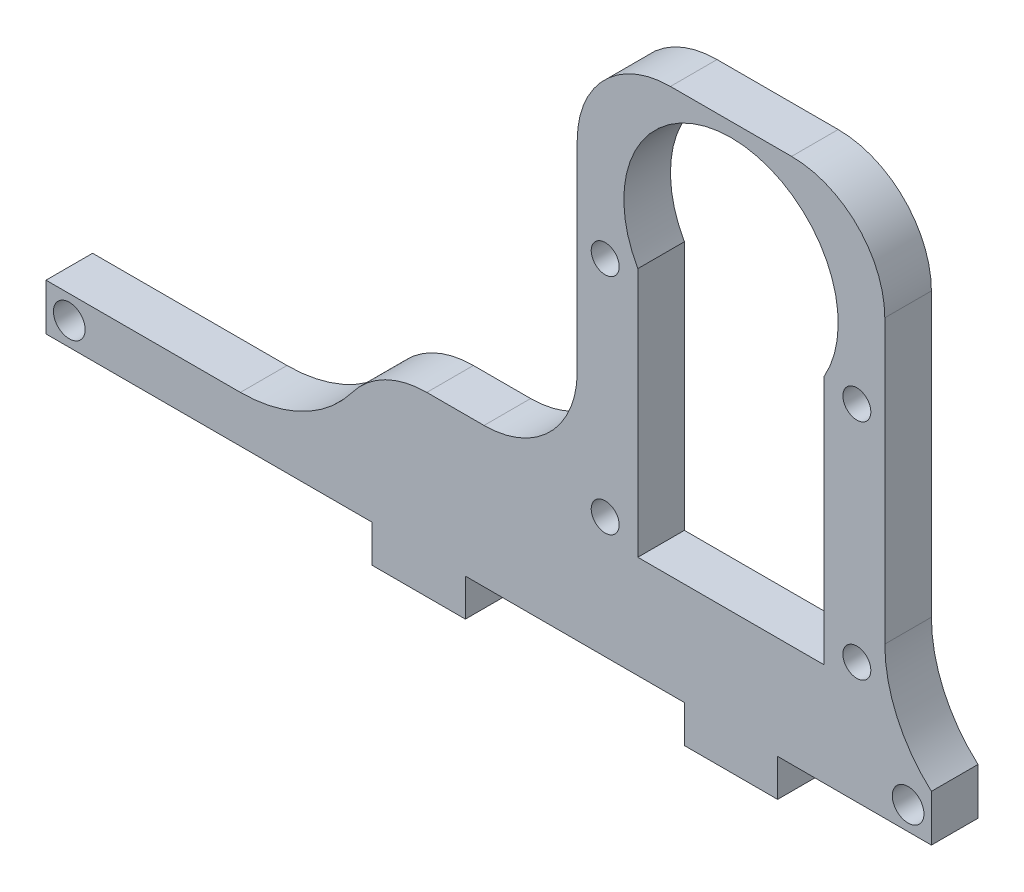
ISO-10303-21;
HEADER;
FILE_DESCRIPTION(('STEP AP214'),'2;1');
FILE_NAME('part.step','',(''),(''),'','','');
FILE_SCHEMA(('AUTOMOTIVE_DESIGN { 1 0 10303 214 1 1 1 1 }'));
ENDSEC;
DATA;
#1=APPLICATION_CONTEXT('core data for automotive mechanical design processes');
#2=APPLICATION_PROTOCOL_DEFINITION('international standard','automotive_design',2000,#1);
#3=PRODUCT_CONTEXT('',#1,'mechanical');
#4=PRODUCT('Part','Part','',(#3));
#5=PRODUCT_RELATED_PRODUCT_CATEGORY('part','',(#4));
#6=PRODUCT_DEFINITION_FORMATION('','',#4);
#7=PRODUCT_DEFINITION_CONTEXT('part definition',#1,'design');
#8=PRODUCT_DEFINITION('design','',#6,#7);
#9=PRODUCT_DEFINITION_SHAPE('','',#8);
#10=(LENGTH_UNIT() NAMED_UNIT(*) SI_UNIT(.MILLI.,.METRE.));
#11=(NAMED_UNIT(*) PLANE_ANGLE_UNIT() SI_UNIT($,.RADIAN.));
#12=(NAMED_UNIT(*) SI_UNIT($,.STERADIAN.) SOLID_ANGLE_UNIT());
#13=UNCERTAINTY_MEASURE_WITH_UNIT(LENGTH_MEASURE(1.E-05),#10,'distance_accuracy_value','');
#14=(GEOMETRIC_REPRESENTATION_CONTEXT(3) GLOBAL_UNCERTAINTY_ASSIGNED_CONTEXT((#13)) GLOBAL_UNIT_ASSIGNED_CONTEXT((#10,
#11,#12)) REPRESENTATION_CONTEXT('',''));
#15=CARTESIAN_POINT('',(0.,0.,0.));
#16=DIRECTION('',(0.,0.,1.));
#17=DIRECTION('',(1.,0.,0.));
#18=AXIS2_PLACEMENT_3D('',#15,#16,#17);
#19=CARTESIAN_POINT('',(5.,-43.5,-5.));
#20=DIRECTION('',(0.,-1.,0.));
#21=DIRECTION('',(0.,0.,-1.));
#22=AXIS2_PLACEMENT_3D('',#19,#20,#21);
#23=PLANE('',#22);
#24=DIRECTION('',(1.,0.,0.));
#25=VECTOR('',#24,1.);
#26=CARTESIAN_POINT('',(5.,-43.5,0.));
#27=LINE('',#26,#25);
#28=CARTESIAN_POINT('',(5.,-43.5,0.));
#29=VERTEX_POINT('',#28);
#30=CARTESIAN_POINT('',(21.5,-43.5,0.));
#31=VERTEX_POINT('',#30);
#32=EDGE_CURVE('E262',#29,#31,#27,.T.);
#33=ORIENTED_EDGE('',*,*,#32,.F.);
#34=DIRECTION('',(0.,0.,1.));
#35=VECTOR('',#34,1.);
#36=CARTESIAN_POINT('',(5.,-43.5,-5.));
#37=LINE('',#36,#35);
#38=CARTESIAN_POINT('',(5.,-43.5,-5.));
#39=VERTEX_POINT('',#38);
#40=EDGE_CURVE('E360',#39,#29,#37,.T.);
#41=ORIENTED_EDGE('',*,*,#40,.F.);
#42=DIRECTION('',(1.,0.,0.));
#43=VECTOR('',#42,1.);
#44=CARTESIAN_POINT('',(16.5,-43.5,-5.));
#45=LINE('',#44,#43);
#46=CARTESIAN_POINT('',(21.5,-43.5,-5.));
#47=VERTEX_POINT('',#46);
#48=EDGE_CURVE('E258',#39,#47,#45,.T.);
#49=ORIENTED_EDGE('',*,*,#48,.T.);
#50=DIRECTION('',(0.,0.,1.));
#51=VECTOR('',#50,1.);
#52=CARTESIAN_POINT('',(21.5,-43.5,-5.));
#53=LINE('',#52,#51);
#54=EDGE_CURVE('E311',#47,#31,#53,.T.);
#55=ORIENTED_EDGE('',*,*,#54,.T.);
#56=EDGE_LOOP('',(#33,#41,#49,#55));
#57=FACE_BOUND('',#56,.T.);
#58=ADVANCED_FACE('F37',(#57),#23,.T.);
#59=CARTESIAN_POINT('',(5.,-47.5,-5.));
#60=DIRECTION('',(1.,0.,0.));
#61=DIRECTION('',(0.,1.,0.));
#62=AXIS2_PLACEMENT_3D('',#59,#60,#61);
#63=PLANE('',#62);
#64=DIRECTION('',(0.,1.,0.));
#65=VECTOR('',#64,1.);
#66=CARTESIAN_POINT('',(5.,-47.5,0.));
#67=LINE('',#66,#65);
#68=CARTESIAN_POINT('',(5.,-47.5,0.));
#69=VERTEX_POINT('',#68);
#70=EDGE_CURVE('E356',#69,#29,#67,.T.);
#71=ORIENTED_EDGE('',*,*,#70,.F.);
#72=DIRECTION('',(0.,0.,1.));
#73=VECTOR('',#72,1.);
#74=CARTESIAN_POINT('',(5.,-47.5,-5.));
#75=LINE('',#74,#73);
#76=CARTESIAN_POINT('',(5.,-47.5,-5.));
#77=VERTEX_POINT('',#76);
#78=EDGE_CURVE('E363',#77,#69,#75,.T.);
#79=ORIENTED_EDGE('',*,*,#78,.F.);
#80=DIRECTION('',(0.,1.,0.));
#81=VECTOR('',#80,1.);
#82=CARTESIAN_POINT('',(5.,-47.5,-5.));
#83=LINE('',#82,#81);
#84=EDGE_CURVE('E308',#77,#39,#83,.T.);
#85=ORIENTED_EDGE('',*,*,#84,.T.);
#86=ORIENTED_EDGE('',*,*,#40,.T.);
#87=EDGE_LOOP('',(#71,#79,#85,#86));
#88=FACE_BOUND('',#87,.T.);
#89=ADVANCED_FACE('F465',(#88),#63,.T.);
#90=CARTESIAN_POINT('',(-5.,-47.5,-5.));
#91=DIRECTION('',(0.,-1.,0.));
#92=DIRECTION('',(0.,0.,-1.));
#93=AXIS2_PLACEMENT_3D('',#90,#91,#92);
#94=PLANE('',#93);
#95=DIRECTION('',(1.,0.,0.));
#96=VECTOR('',#95,1.);
#97=CARTESIAN_POINT('',(-5.,-47.5,0.));
#98=LINE('',#97,#96);
#99=CARTESIAN_POINT('',(-5.,-47.5,0.));
#100=VERTEX_POINT('',#99);
#101=EDGE_CURVE('E353',#100,#69,#98,.T.);
#102=ORIENTED_EDGE('',*,*,#101,.F.);
#103=DIRECTION('',(0.,0.,1.));
#104=VECTOR('',#103,1.);
#105=CARTESIAN_POINT('',(-5.,-47.5,-5.));
#106=LINE('',#105,#104);
#107=CARTESIAN_POINT('',(-5.,-47.5,-5.));
#108=VERTEX_POINT('',#107);
#109=EDGE_CURVE('E365',#108,#100,#106,.T.);
#110=ORIENTED_EDGE('',*,*,#109,.F.);
#111=DIRECTION('',(1.,0.,0.));
#112=VECTOR('',#111,1.);
#113=CARTESIAN_POINT('',(-5.,-47.5,-5.));
#114=LINE('',#113,#112);
#115=EDGE_CURVE('E305',#108,#77,#114,.T.);
#116=ORIENTED_EDGE('',*,*,#115,.T.);
#117=ORIENTED_EDGE('',*,*,#78,.T.);
#118=EDGE_LOOP('',(#102,#110,#116,#117));
#119=FACE_BOUND('',#118,.T.);
#120=ADVANCED_FACE('F468',(#119),#94,.T.);
#121=CARTESIAN_POINT('',(-5.,-43.5,-5.));
#122=DIRECTION('',(-1.,0.,0.));
#123=DIRECTION('',(0.,-1.,0.));
#124=AXIS2_PLACEMENT_3D('',#121,#122,#123);
#125=PLANE('',#124);
#126=DIRECTION('',(0.,-1.,0.));
#127=VECTOR('',#126,1.);
#128=CARTESIAN_POINT('',(-5.,-43.5,0.));
#129=LINE('',#128,#127);
#130=CARTESIAN_POINT('',(-5.,-43.5,0.));
#131=VERTEX_POINT('',#130);
#132=EDGE_CURVE('E350',#131,#100,#129,.T.);
#133=ORIENTED_EDGE('',*,*,#132,.F.);
#134=DIRECTION('',(0.,0.,1.));
#135=VECTOR('',#134,1.);
#136=CARTESIAN_POINT('',(-5.,-43.5,-5.));
#137=LINE('',#136,#135);
#138=CARTESIAN_POINT('',(-5.,-43.5,-5.));
#139=VERTEX_POINT('',#138);
#140=EDGE_CURVE('E367',#139,#131,#137,.T.);
#141=ORIENTED_EDGE('',*,*,#140,.F.);
#142=DIRECTION('',(0.,-1.,0.));
#143=VECTOR('',#142,1.);
#144=CARTESIAN_POINT('',(-5.,-43.5,-5.));
#145=LINE('',#144,#143);
#146=EDGE_CURVE('E302',#139,#108,#145,.T.);
#147=ORIENTED_EDGE('',*,*,#146,.T.);
#148=ORIENTED_EDGE('',*,*,#109,.T.);
#149=EDGE_LOOP('',(#133,#141,#147,#148));
#150=FACE_BOUND('',#149,.T.);
#151=ADVANCED_FACE('F473',(#150),#125,.T.);
#152=CARTESIAN_POINT('',(-28.5,-43.5,-5.));
#153=DIRECTION('',(0.,-1.,0.));
#154=DIRECTION('',(0.,0.,-1.));
#155=AXIS2_PLACEMENT_3D('',#152,#153,#154);
#156=PLANE('',#155);
#157=DIRECTION('',(1.,0.,0.));
#158=VECTOR('',#157,1.);
#159=CARTESIAN_POINT('',(-28.5,-43.5,0.));
#160=LINE('',#159,#158);
#161=CARTESIAN_POINT('',(-28.5,-43.5,0.));
#162=VERTEX_POINT('',#161);
#163=EDGE_CURVE('E347',#162,#131,#160,.T.);
#164=ORIENTED_EDGE('',*,*,#163,.F.);
#165=DIRECTION('',(0.,0.,1.));
#166=VECTOR('',#165,1.);
#167=CARTESIAN_POINT('',(-28.5,-43.5,-5.));
#168=LINE('',#167,#166);
#169=CARTESIAN_POINT('',(-28.5,-43.5,-5.));
#170=VERTEX_POINT('',#169);
#171=EDGE_CURVE('E369',#170,#162,#168,.T.);
#172=ORIENTED_EDGE('',*,*,#171,.F.);
#173=DIRECTION('',(1.,0.,0.));
#174=VECTOR('',#173,1.);
#175=CARTESIAN_POINT('',(-28.5,-43.5,-5.));
#176=LINE('',#175,#174);
#177=EDGE_CURVE('E299',#170,#139,#176,.T.);
#178=ORIENTED_EDGE('',*,*,#177,.T.);
#179=ORIENTED_EDGE('',*,*,#140,.T.);
#180=EDGE_LOOP('',(#164,#172,#178,#179));
#181=FACE_BOUND('',#180,.T.);
#182=ADVANCED_FACE('F476',(#181),#156,.T.);
#183=CARTESIAN_POINT('',(-28.5,-43.5,-5.));
#184=DIRECTION('',(1.,0.,0.));
#185=DIRECTION('',(0.,1.,0.));
#186=AXIS2_PLACEMENT_3D('',#183,#184,#185);
#187=PLANE('',#186);
#188=DIRECTION('',(0.,1.,0.));
#189=VECTOR('',#188,1.);
#190=CARTESIAN_POINT('',(-28.5,-43.5,0.));
#191=LINE('',#190,#189);
#192=CARTESIAN_POINT('',(-28.5,-47.5,0.));
#193=VERTEX_POINT('',#192);
#194=EDGE_CURVE('E344',#193,#162,#191,.T.);
#195=ORIENTED_EDGE('',*,*,#194,.F.);
#196=DIRECTION('',(0.,0.,1.));
#197=VECTOR('',#196,1.);
#198=CARTESIAN_POINT('',(-28.5,-47.5,-5.));
#199=LINE('',#198,#197);
#200=CARTESIAN_POINT('',(-28.5,-47.5,-5.));
#201=VERTEX_POINT('',#200);
#202=EDGE_CURVE('E371',#201,#193,#199,.T.);
#203=ORIENTED_EDGE('',*,*,#202,.F.);
#204=DIRECTION('',(0.,1.,0.));
#205=VECTOR('',#204,1.);
#206=CARTESIAN_POINT('',(-28.5,-43.5,-5.));
#207=LINE('',#206,#205);
#208=EDGE_CURVE('E296',#201,#170,#207,.T.);
#209=ORIENTED_EDGE('',*,*,#208,.T.);
#210=ORIENTED_EDGE('',*,*,#171,.T.);
#211=EDGE_LOOP('',(#195,#203,#209,#210));
#212=FACE_BOUND('',#211,.T.);
#213=ADVANCED_FACE('F481',(#212),#187,.T.);
#214=CARTESIAN_POINT('',(-38.5,-47.5,-5.));
#215=DIRECTION('',(0.,-1.,0.));
#216=DIRECTION('',(1.,0.,0.));
#217=AXIS2_PLACEMENT_3D('',#214,#215,#216);
#218=PLANE('',#217);
#219=DIRECTION('',(1.,0.,0.));
#220=VECTOR('',#219,1.);
#221=CARTESIAN_POINT('',(-38.5,-47.5,0.));
#222=LINE('',#221,#220);
#223=CARTESIAN_POINT('',(-38.5,-47.5,0.));
#224=VERTEX_POINT('',#223);
#225=EDGE_CURVE('E341',#224,#193,#222,.T.);
#226=ORIENTED_EDGE('',*,*,#225,.F.);
#227=DIRECTION('',(0.,0.,1.));
#228=VECTOR('',#227,1.);
#229=CARTESIAN_POINT('',(-38.5,-47.5,-5.));
#230=LINE('',#229,#228);
#231=CARTESIAN_POINT('',(-38.5,-47.5,-5.));
#232=VERTEX_POINT('',#231);
#233=EDGE_CURVE('E373',#232,#224,#230,.T.);
#234=ORIENTED_EDGE('',*,*,#233,.F.);
#235=DIRECTION('',(1.,0.,0.));
#236=VECTOR('',#235,1.);
#237=CARTESIAN_POINT('',(-38.5,-47.5,-5.));
#238=LINE('',#237,#236);
#239=EDGE_CURVE('E293',#232,#201,#238,.T.);
#240=ORIENTED_EDGE('',*,*,#239,.T.);
#241=ORIENTED_EDGE('',*,*,#202,.T.);
#242=EDGE_LOOP('',(#226,#234,#240,#241));
#243=FACE_BOUND('',#242,.T.);
#244=ADVANCED_FACE('F484',(#243),#218,.T.);
#245=CARTESIAN_POINT('',(-38.5,-43.5,-5.));
#246=DIRECTION('',(-1.,0.,0.));
#247=DIRECTION('',(0.,0.,1.));
#248=AXIS2_PLACEMENT_3D('',#245,#246,#247);
#249=PLANE('',#248);
#250=DIRECTION('',(0.,-1.,0.));
#251=VECTOR('',#250,1.);
#252=CARTESIAN_POINT('',(-38.5,-43.5,0.));
#253=LINE('',#252,#251);
#254=CARTESIAN_POINT('',(-38.5,-43.5,0.));
#255=VERTEX_POINT('',#254);
#256=EDGE_CURVE('E338',#255,#224,#253,.T.);
#257=ORIENTED_EDGE('',*,*,#256,.F.);
#258=DIRECTION('',(0.,0.,1.));
#259=VECTOR('',#258,1.);
#260=CARTESIAN_POINT('',(-38.5,-43.5,-5.));
#261=LINE('',#260,#259);
#262=CARTESIAN_POINT('',(-38.5,-43.5,-5.));
#263=VERTEX_POINT('',#262);
#264=EDGE_CURVE('E375',#263,#255,#261,.T.);
#265=ORIENTED_EDGE('',*,*,#264,.F.);
#266=DIRECTION('',(0.,-1.,0.));
#267=VECTOR('',#266,1.);
#268=CARTESIAN_POINT('',(-38.5,-43.5,-5.));
#269=LINE('',#268,#267);
#270=EDGE_CURVE('E290',#263,#232,#269,.T.);
#271=ORIENTED_EDGE('',*,*,#270,.T.);
#272=ORIENTED_EDGE('',*,*,#233,.T.);
#273=EDGE_LOOP('',(#257,#265,#271,#272));
#274=FACE_BOUND('',#273,.T.);
#275=ADVANCED_FACE('F489',(#274),#249,.T.);
#276=CARTESIAN_POINT('',(-38.5,-43.5,-5.));
#277=DIRECTION('',(0.,-1.,0.));
#278=DIRECTION('',(1.,0.,0.));
#279=AXIS2_PLACEMENT_3D('',#276,#277,#278);
#280=PLANE('',#279);
#281=DIRECTION('',(1.,0.,0.));
#282=VECTOR('',#281,1.);
#283=CARTESIAN_POINT('',(-38.5,-43.5,0.));
#284=LINE('',#283,#282);
#285=CARTESIAN_POINT('',(-73.5,-43.5,0.));
#286=VERTEX_POINT('',#285);
#287=EDGE_CURVE('E335',#286,#255,#284,.T.);
#288=ORIENTED_EDGE('',*,*,#287,.F.);
#289=DIRECTION('',(0.,0.,1.));
#290=VECTOR('',#289,1.);
#291=CARTESIAN_POINT('',(-73.5,-43.5,-5.));
#292=LINE('',#291,#290);
#293=CARTESIAN_POINT('',(-73.5,-43.5,-5.));
#294=VERTEX_POINT('',#293);
#295=EDGE_CURVE('E377',#294,#286,#292,.T.);
#296=ORIENTED_EDGE('',*,*,#295,.F.);
#297=DIRECTION('',(1.,0.,0.));
#298=VECTOR('',#297,1.);
#299=CARTESIAN_POINT('',(-38.5,-43.5,-5.));
#300=LINE('',#299,#298);
#301=EDGE_CURVE('E287',#294,#263,#300,.T.);
#302=ORIENTED_EDGE('',*,*,#301,.T.);
#303=ORIENTED_EDGE('',*,*,#264,.T.);
#304=EDGE_LOOP('',(#288,#296,#302,#303));
#305=FACE_BOUND('',#304,.T.);
#306=ADVANCED_FACE('F492',(#305),#280,.T.);
#307=CARTESIAN_POINT('',(-73.5,-43.5,-5.));
#308=DIRECTION('',(-1.,0.,0.));
#309=DIRECTION('',(0.,0.,1.));
#310=AXIS2_PLACEMENT_3D('',#307,#308,#309);
#311=PLANE('',#310);
#312=DIRECTION('',(0.,-1.,0.));
#313=VECTOR('',#312,1.);
#314=CARTESIAN_POINT('',(-73.5,-43.5,0.));
#315=LINE('',#314,#313);
#316=CARTESIAN_POINT('',(-73.5,-38.5,0.));
#317=VERTEX_POINT('',#316);
#318=EDGE_CURVE('E332',#317,#286,#315,.T.);
#319=ORIENTED_EDGE('',*,*,#318,.F.);
#320=DIRECTION('',(0.,0.,1.));
#321=VECTOR('',#320,1.);
#322=CARTESIAN_POINT('',(-73.5,-38.5,-5.));
#323=LINE('',#322,#321);
#324=CARTESIAN_POINT('',(-73.5,-38.5,-5.));
#325=VERTEX_POINT('',#324);
#326=EDGE_CURVE('E379',#325,#317,#323,.T.);
#327=ORIENTED_EDGE('',*,*,#326,.F.);
#328=DIRECTION('',(0.,-1.,0.));
#329=VECTOR('',#328,1.);
#330=CARTESIAN_POINT('',(-73.5,-43.5,-5.));
#331=LINE('',#330,#329);
#332=EDGE_CURVE('E284',#325,#294,#331,.T.);
#333=ORIENTED_EDGE('',*,*,#332,.T.);
#334=ORIENTED_EDGE('',*,*,#295,.T.);
#335=EDGE_LOOP('',(#319,#327,#333,#334));
#336=FACE_BOUND('',#335,.T.);
#337=ADVANCED_FACE('F498',(#336),#311,.T.);
#338=CARTESIAN_POINT('',(-38.5,-38.5,-5.));
#339=DIRECTION('',(0.,1.,0.));
#340=DIRECTION('',(-1.,0.,0.));
#341=AXIS2_PLACEMENT_3D('',#338,#339,#340);
#342=PLANE('',#341);
#343=DIRECTION('',(-1.,0.,0.));
#344=VECTOR('',#343,1.);
#345=CARTESIAN_POINT('',(-38.5,-38.5,0.));
#346=LINE('',#345,#344);
#347=CARTESIAN_POINT('',(-52.6421356237309,-38.5,0.));
#348=VERTEX_POINT('',#347);
#349=EDGE_CURVE('E330',#348,#317,#346,.T.);
#350=ORIENTED_EDGE('',*,*,#349,.F.);
#351=DIRECTION('',(0.,0.,1.));
#352=VECTOR('',#351,1.);
#353=CARTESIAN_POINT('',(-52.6421356237309,-38.5,-5.));
#354=LINE('',#353,#352);
#355=CARTESIAN_POINT('',(-52.6421356237309,-38.5,-5.));
#356=VERTEX_POINT('',#355);
#357=EDGE_CURVE('E362',#348,#356,#354,.F.);
#358=ORIENTED_EDGE('',*,*,#357,.T.);
#359=DIRECTION('',(-1.,0.,0.));
#360=VECTOR('',#359,1.);
#361=CARTESIAN_POINT('',(-38.5,-38.5,-5.));
#362=LINE('',#361,#360);
#363=EDGE_CURVE('E282',#356,#325,#362,.T.);
#364=ORIENTED_EDGE('',*,*,#363,.T.);
#365=ORIENTED_EDGE('',*,*,#326,.T.);
#366=EDGE_LOOP('',(#350,#358,#364,#365));
#367=FACE_BOUND('',#366,.T.);
#368=ADVANCED_FACE('F501',(#367),#342,.T.);
#369=CARTESIAN_POINT('',(-16.5,-28.5,-5.));
#370=DIRECTION('',(0.,1.,0.));
#371=DIRECTION('',(-1.,0.,0.));
#372=AXIS2_PLACEMENT_3D('',#369,#370,#371);
#373=PLANE('',#372);
#374=DIRECTION('',(-1.,0.,0.));
#375=VECTOR('',#374,1.);
#376=CARTESIAN_POINT('',(-16.5,-28.5,0.));
#377=LINE('',#376,#375);
#378=CARTESIAN_POINT('',(-26.5,-28.5,0.));
#379=VERTEX_POINT('',#378);
#380=CARTESIAN_POINT('',(-32.6421356237309,-28.5,0.));
#381=VERTEX_POINT('',#380);
#382=EDGE_CURVE('E328',#379,#381,#377,.T.);
#383=ORIENTED_EDGE('',*,*,#382,.F.);
#384=DIRECTION('',(0.,0.,1.));
#385=VECTOR('',#384,1.);
#386=CARTESIAN_POINT('',(-26.5,-28.5,-5.));
#387=LINE('',#386,#385);
#388=CARTESIAN_POINT('',(-26.5,-28.5,-5.));
#389=VERTEX_POINT('',#388);
#390=EDGE_CURVE('E413',#379,#389,#387,.F.);
#391=ORIENTED_EDGE('',*,*,#390,.T.);
#392=DIRECTION('',(-1.,0.,0.));
#393=VECTOR('',#392,1.);
#394=CARTESIAN_POINT('',(-16.5,-28.5,-5.));
#395=LINE('',#394,#393);
#396=CARTESIAN_POINT('',(-32.6421356237309,-28.5,-5.));
#397=VERTEX_POINT('',#396);
#398=EDGE_CURVE('E279',#389,#397,#395,.T.);
#399=ORIENTED_EDGE('',*,*,#398,.T.);
#400=DIRECTION('',(0.,0.,1.));
#401=VECTOR('',#400,1.);
#402=CARTESIAN_POINT('',(-32.6421356237309,-28.5,0.));
#403=LINE('',#402,#401);
#404=EDGE_CURVE('E410',#397,#381,#403,.T.);
#405=ORIENTED_EDGE('',*,*,#404,.T.);
#406=EDGE_LOOP('',(#383,#391,#399,#405));
#407=FACE_BOUND('',#406,.T.);
#408=ADVANCED_FACE('F425',(#407),#373,.T.);
#409=CARTESIAN_POINT('',(-16.5,3.,-5.));
#410=DIRECTION('',(-1.,0.,0.));
#411=DIRECTION('',(0.,-1.,0.));
#412=AXIS2_PLACEMENT_3D('',#409,#410,#411);
#413=PLANE('',#412);
#414=DIRECTION('',(0.,-1.,0.));
#415=VECTOR('',#414,1.);
#416=CARTESIAN_POINT('',(-16.5,3.,-5.));
#417=LINE('',#416,#415);
#418=CARTESIAN_POINT('',(-16.5,3.,-5.));
#419=VERTEX_POINT('',#418);
#420=CARTESIAN_POINT('',(-16.5,-18.5,-5.));
#421=VERTEX_POINT('',#420);
#422=EDGE_CURVE('E276',#419,#421,#417,.T.);
#423=ORIENTED_EDGE('',*,*,#422,.T.);
#424=DIRECTION('',(0.,0.,1.));
#425=VECTOR('',#424,1.);
#426=CARTESIAN_POINT('',(-16.5,-18.5,0.));
#427=LINE('',#426,#425);
#428=CARTESIAN_POINT('',(-16.5,-18.5,0.));
#429=VERTEX_POINT('',#428);
#430=EDGE_CURVE('E407',#421,#429,#427,.T.);
#431=ORIENTED_EDGE('',*,*,#430,.T.);
#432=DIRECTION('',(0.,-1.,0.));
#433=VECTOR('',#432,1.);
#434=CARTESIAN_POINT('',(-16.5,3.,0.));
#435=LINE('',#434,#433);
#436=CARTESIAN_POINT('',(-16.5,3.,0.));
#437=VERTEX_POINT('',#436);
#438=EDGE_CURVE('E325',#437,#429,#435,.T.);
#439=ORIENTED_EDGE('',*,*,#438,.F.);
#440=DIRECTION('',(0.,0.,1.));
#441=VECTOR('',#440,1.);
#442=CARTESIAN_POINT('',(-16.5,3.,-5.));
#443=LINE('',#442,#441);
#444=EDGE_CURVE('E382',#419,#437,#443,.T.);
#445=ORIENTED_EDGE('',*,*,#444,.F.);
#446=EDGE_LOOP('',(#423,#431,#439,#445));
#447=FACE_BOUND('',#446,.T.);
#448=ADVANCED_FACE('F433',(#447),#413,.T.);
#449=CARTESIAN_POINT('',(-6.5,3.,-5.));
#450=DIRECTION('',(0.,0.,1.));
#451=DIRECTION('',(1.,0.,0.));
#452=AXIS2_PLACEMENT_3D('',#449,#450,#451);
#453=CYLINDRICAL_SURFACE('',#452,10.);
#454=CARTESIAN_POINT('',(-6.5,3.,0.));
#455=DIRECTION('',(0.,0.,1.));
#456=DIRECTION('',(1.,0.,0.));
#457=AXIS2_PLACEMENT_3D('',#454,#455,#456);
#458=CIRCLE('',#457,10.);
#459=CARTESIAN_POINT('',(-6.5,13.,0.));
#460=VERTEX_POINT('',#459);
#461=EDGE_CURVE('E322',#460,#437,#458,.T.);
#462=ORIENTED_EDGE('',*,*,#461,.F.);
#463=DIRECTION('',(0.,0.,1.));
#464=VECTOR('',#463,1.);
#465=CARTESIAN_POINT('',(-6.5,13.,-5.));
#466=LINE('',#465,#464);
#467=CARTESIAN_POINT('',(-6.5,13.,-5.));
#468=VERTEX_POINT('',#467);
#469=EDGE_CURVE('E384',#468,#460,#466,.T.);
#470=ORIENTED_EDGE('',*,*,#469,.F.);
#471=CARTESIAN_POINT('',(-6.5,3.,-5.));
#472=DIRECTION('',(0.,0.,1.));
#473=DIRECTION('',(1.,0.,0.));
#474=AXIS2_PLACEMENT_3D('',#471,#472,#473);
#475=CIRCLE('',#474,10.);
#476=EDGE_CURVE('E273',#468,#419,#475,.T.);
#477=ORIENTED_EDGE('',*,*,#476,.T.);
#478=ORIENTED_EDGE('',*,*,#444,.T.);
#479=EDGE_LOOP('',(#462,#470,#477,#478));
#480=FACE_BOUND('',#479,.T.);
#481=ADVANCED_FACE('F436',(#480),#453,.T.);
#482=CARTESIAN_POINT('',(-6.5,13.,-5.));
#483=DIRECTION('',(0.,1.,0.));
#484=DIRECTION('',(0.,0.,1.));
#485=AXIS2_PLACEMENT_3D('',#482,#483,#484);
#486=PLANE('',#485);
#487=DIRECTION('',(-1.,0.,0.));
#488=VECTOR('',#487,1.);
#489=CARTESIAN_POINT('',(-6.5,13.,0.));
#490=LINE('',#489,#488);
#491=CARTESIAN_POINT('',(6.5,13.,0.));
#492=VERTEX_POINT('',#491);
#493=EDGE_CURVE('E319',#492,#460,#490,.T.);
#494=ORIENTED_EDGE('',*,*,#493,.F.);
#495=DIRECTION('',(0.,0.,1.));
#496=VECTOR('',#495,1.);
#497=CARTESIAN_POINT('',(6.5,13.,-5.));
#498=LINE('',#497,#496);
#499=CARTESIAN_POINT('',(6.5,13.,-5.));
#500=VERTEX_POINT('',#499);
#501=EDGE_CURVE('E386',#500,#492,#498,.T.);
#502=ORIENTED_EDGE('',*,*,#501,.F.);
#503=DIRECTION('',(-1.,0.,0.));
#504=VECTOR('',#503,1.);
#505=CARTESIAN_POINT('',(-6.5,13.,-5.));
#506=LINE('',#505,#504);
#507=EDGE_CURVE('E270',#500,#468,#506,.T.);
#508=ORIENTED_EDGE('',*,*,#507,.T.);
#509=ORIENTED_EDGE('',*,*,#469,.T.);
#510=EDGE_LOOP('',(#494,#502,#508,#509));
#511=FACE_BOUND('',#510,.T.);
#512=ADVANCED_FACE('F441',(#511),#486,.T.);
#513=CARTESIAN_POINT('',(6.5,3.,-5.));
#514=DIRECTION('',(0.,0.,1.));
#515=DIRECTION('',(1.,0.,0.));
#516=AXIS2_PLACEMENT_3D('',#513,#514,#515);
#517=CYLINDRICAL_SURFACE('',#516,10.);
#518=CARTESIAN_POINT('',(6.5,3.,0.));
#519=DIRECTION('',(0.,0.,1.));
#520=DIRECTION('',(-1.,0.,0.));
#521=AXIS2_PLACEMENT_3D('',#518,#519,#520);
#522=CIRCLE('',#521,10.);
#523=CARTESIAN_POINT('',(16.5,3.,0.));
#524=VERTEX_POINT('',#523);
#525=EDGE_CURVE('E316',#524,#492,#522,.T.);
#526=ORIENTED_EDGE('',*,*,#525,.F.);
#527=DIRECTION('',(0.,0.,1.));
#528=VECTOR('',#527,1.);
#529=CARTESIAN_POINT('',(16.5,3.,-5.));
#530=LINE('',#529,#528);
#531=CARTESIAN_POINT('',(16.5,3.,-5.));
#532=VERTEX_POINT('',#531);
#533=EDGE_CURVE('E388',#532,#524,#530,.T.);
#534=ORIENTED_EDGE('',*,*,#533,.F.);
#535=CARTESIAN_POINT('',(6.5,3.,-5.));
#536=DIRECTION('',(0.,0.,1.));
#537=DIRECTION('',(-1.,0.,0.));
#538=AXIS2_PLACEMENT_3D('',#535,#536,#537);
#539=CIRCLE('',#538,10.);
#540=EDGE_CURVE('E267',#532,#500,#539,.T.);
#541=ORIENTED_EDGE('',*,*,#540,.T.);
#542=ORIENTED_EDGE('',*,*,#501,.T.);
#543=EDGE_LOOP('',(#526,#534,#541,#542));
#544=FACE_BOUND('',#543,.T.);
#545=ADVANCED_FACE('F444',(#544),#517,.T.);
#546=CARTESIAN_POINT('',(16.5,3.,-5.));
#547=DIRECTION('',(1.,0.,0.));
#548=DIRECTION('',(0.,1.,0.));
#549=AXIS2_PLACEMENT_3D('',#546,#547,#548);
#550=PLANE('',#549);
#551=DIRECTION('',(0.,1.,0.));
#552=VECTOR('',#551,1.);
#553=CARTESIAN_POINT('',(16.5,3.,0.));
#554=LINE('',#553,#552);
#555=CARTESIAN_POINT('',(16.5,-27.3196601125011,0.));
#556=VERTEX_POINT('',#555);
#557=EDGE_CURVE('E314',#556,#524,#554,.T.);
#558=ORIENTED_EDGE('',*,*,#557,.F.);
#559=DIRECTION('',(0.,0.,1.));
#560=VECTOR('',#559,1.);
#561=CARTESIAN_POINT('',(16.5,-27.3196601125011,-5.));
#562=LINE('',#561,#560);
#563=CARTESIAN_POINT('',(16.5,-27.3196601125011,-5.));
#564=VERTEX_POINT('',#563);
#565=EDGE_CURVE('E397',#556,#564,#562,.F.);
#566=ORIENTED_EDGE('',*,*,#565,.T.);
#567=DIRECTION('',(0.,1.,0.));
#568=VECTOR('',#567,1.);
#569=CARTESIAN_POINT('',(16.5,3.,-5.));
#570=LINE('',#569,#568);
#571=EDGE_CURVE('E265',#564,#532,#570,.T.);
#572=ORIENTED_EDGE('',*,*,#571,.T.);
#573=ORIENTED_EDGE('',*,*,#533,.T.);
#574=EDGE_LOOP('',(#558,#566,#572,#573));
#575=FACE_BOUND('',#574,.T.);
#576=ADVANCED_FACE('F547',(#575),#550,.T.);
#577=CARTESIAN_POINT('',(21.5,-43.5,-5.));
#578=DIRECTION('',(1.,0.,0.));
#579=DIRECTION('',(0.,1.,0.));
#580=AXIS2_PLACEMENT_3D('',#577,#578,#579);
#581=PLANE('',#580);
#582=DIRECTION('',(0.,1.,0.));
#583=VECTOR('',#582,1.);
#584=CARTESIAN_POINT('',(21.5,-43.5,0.));
#585=LINE('',#584,#583);
#586=CARTESIAN_POINT('',(21.5,-38.5,0.));
#587=VERTEX_POINT('',#586);
#588=EDGE_CURVE('E254',#31,#587,#585,.T.);
#589=ORIENTED_EDGE('',*,*,#588,.F.);
#590=ORIENTED_EDGE('',*,*,#54,.F.);
#591=DIRECTION('',(0.,1.,0.));
#592=VECTOR('',#591,1.);
#593=CARTESIAN_POINT('',(21.5,-43.5,-5.));
#594=LINE('',#593,#592);
#595=CARTESIAN_POINT('',(21.5,-38.5,-5.));
#596=VERTEX_POINT('',#595);
#597=EDGE_CURVE('E261',#47,#596,#594,.T.);
#598=ORIENTED_EDGE('',*,*,#597,.T.);
#599=DIRECTION('',(0.,0.,1.));
#600=VECTOR('',#599,1.);
#601=CARTESIAN_POINT('',(21.5,-38.5,-5.));
#602=LINE('',#601,#600);
#603=EDGE_CURVE('E391',#596,#587,#602,.T.);
#604=ORIENTED_EDGE('',*,*,#603,.T.);
#605=EDGE_LOOP('',(#589,#590,#598,#604));
#606=FACE_BOUND('',#605,.T.);
#607=ADVANCED_FACE('F456',(#606),#581,.T.);
#608=CARTESIAN_POINT('',(6.5,3.,-5.));
#609=DIRECTION('',(0.,0.,-1.));
#610=DIRECTION('',(-1.,0.,0.));
#611=AXIS2_PLACEMENT_3D('',#608,#609,#610);
#612=PLANE('',#611);
#613=CARTESIAN_POINT('',(-71.,-41.,-5.));
#614=DIRECTION('',(0.,0.,1.));
#615=DIRECTION('',(1.,0.,0.));
#616=AXIS2_PLACEMENT_3D('',#613,#614,#615);
#617=CIRCLE('',#616,1.7);
#618=CARTESIAN_POINT('',(-69.3,-41.,-5.));
#619=VERTEX_POINT('',#618);
#620=EDGE_CURVE('E859',#619,#619,#617,.T.);
#621=ORIENTED_EDGE('',*,*,#620,.T.);
#622=EDGE_LOOP('',(#621));
#623=FACE_BOUND('',#622,.T.);
#624=CARTESIAN_POINT('',(19.,-41.,-5.));
#625=DIRECTION('',(0.,0.,1.));
#626=DIRECTION('',(1.,0.,0.));
#627=AXIS2_PLACEMENT_3D('',#624,#625,#626);
#628=CIRCLE('',#627,1.7);
#629=CARTESIAN_POINT('',(20.7,-41.,-5.));
#630=VERTEX_POINT('',#629);
#631=EDGE_CURVE('E867',#630,#630,#628,.T.);
#632=ORIENTED_EDGE('',*,*,#631,.T.);
#633=EDGE_LOOP('',(#632));
#634=FACE_BOUND('',#633,.T.);
#635=CARTESIAN_POINT('',(13.5,-30.5,-5.));
#636=DIRECTION('',(0.,0.,1.));
#637=DIRECTION('',(1.,0.,0.));
#638=AXIS2_PLACEMENT_3D('',#635,#636,#637);
#639=CIRCLE('',#638,1.5);
#640=CARTESIAN_POINT('',(15.,-30.5,-5.));
#641=VERTEX_POINT('',#640);
#642=EDGE_CURVE('E873',#641,#641,#639,.T.);
#643=ORIENTED_EDGE('',*,*,#642,.T.);
#644=EDGE_LOOP('',(#643));
#645=FACE_BOUND('',#644,.T.);
#646=CARTESIAN_POINT('',(13.5,-6.5,-5.));
#647=DIRECTION('',(0.,0.,1.));
#648=DIRECTION('',(1.,0.,0.));
#649=AXIS2_PLACEMENT_3D('',#646,#647,#648);
#650=CIRCLE('',#649,1.5);
#651=CARTESIAN_POINT('',(15.,-6.5,-5.));
#652=VERTEX_POINT('',#651);
#653=EDGE_CURVE('E879',#652,#652,#650,.T.);
#654=ORIENTED_EDGE('',*,*,#653,.T.);
#655=EDGE_LOOP('',(#654));
#656=FACE_BOUND('',#655,.T.);
#657=CARTESIAN_POINT('',(-13.5,-30.5,-5.));
#658=DIRECTION('',(0.,0.,1.));
#659=DIRECTION('',(1.,0.,0.));
#660=AXIS2_PLACEMENT_3D('',#657,#658,#659);
#661=CIRCLE('',#660,1.5);
#662=CARTESIAN_POINT('',(-12.,-30.5,-5.));
#663=VERTEX_POINT('',#662);
#664=EDGE_CURVE('E885',#663,#663,#661,.T.);
#665=ORIENTED_EDGE('',*,*,#664,.T.);
#666=EDGE_LOOP('',(#665));
#667=FACE_BOUND('',#666,.T.);
#668=CARTESIAN_POINT('',(-13.5,-6.5,-5.));
#669=DIRECTION('',(0.,0.,1.));
#670=DIRECTION('',(1.,0.,0.));
#671=AXIS2_PLACEMENT_3D('',#668,#669,#670);
#672=CIRCLE('',#671,1.5);
#673=CARTESIAN_POINT('',(-12.,-6.5,-5.));
#674=VERTEX_POINT('',#673);
#675=EDGE_CURVE('E248',#674,#674,#672,.T.);
#676=ORIENTED_EDGE('',*,*,#675,.T.);
#677=EDGE_LOOP('',(#676));
#678=FACE_BOUND('',#677,.T.);
#679=CARTESIAN_POINT('',(0.,0.,-5.));
#680=DIRECTION('',(0.,0.,1.));
#681=DIRECTION('',(1.,0.,0.));
#682=AXIS2_PLACEMENT_3D('',#679,#680,#681);
#683=CIRCLE('',#682,11.5);
#684=CARTESIAN_POINT('',(10.,-5.67890834580028,-5.));
#685=VERTEX_POINT('',#684);
#686=CARTESIAN_POINT('',(-10.,-5.67890834580028,-5.));
#687=VERTEX_POINT('',#686);
#688=EDGE_CURVE('E214',#685,#687,#683,.T.);
#689=ORIENTED_EDGE('',*,*,#688,.T.);
#690=DIRECTION('',(0.,-1.,0.));
#691=VECTOR('',#690,1.);
#692=CARTESIAN_POINT('',(-10.,-5.67890834580028,-5.));
#693=LINE('',#692,#691);
#694=CARTESIAN_POINT('',(-10.,-32.5,-5.));
#695=VERTEX_POINT('',#694);
#696=EDGE_CURVE('E226',#687,#695,#693,.T.);
#697=ORIENTED_EDGE('',*,*,#696,.T.);
#698=DIRECTION('',(1.,0.,0.));
#699=VECTOR('',#698,1.);
#700=CARTESIAN_POINT('',(-10.,-32.5,-5.));
#701=LINE('',#700,#699);
#702=CARTESIAN_POINT('',(10.,-32.5,-5.));
#703=VERTEX_POINT('',#702);
#704=EDGE_CURVE('E230',#695,#703,#701,.T.);
#705=ORIENTED_EDGE('',*,*,#704,.T.);
#706=DIRECTION('',(0.,1.,0.));
#707=VECTOR('',#706,1.);
#708=CARTESIAN_POINT('',(10.,-5.67890834580028,-5.));
#709=LINE('',#708,#707);
#710=EDGE_CURVE('E222',#703,#685,#709,.T.);
#711=ORIENTED_EDGE('',*,*,#710,.T.);
#712=EDGE_LOOP('',(#689,#697,#705,#711));
#713=FACE_BOUND('',#712,.T.);
#714=CARTESIAN_POINT('',(-52.6421356237309,-23.5,-5.));
#715=DIRECTION('',(0.,0.,-1.));
#716=DIRECTION('',(-1.,0.,0.));
#717=AXIS2_PLACEMENT_3D('',#714,#715,#716);
#718=CIRCLE('',#717,15.);
#719=CARTESIAN_POINT('',(-40.6421356237309,-32.5,-5.));
#720=VERTEX_POINT('',#719);
#721=EDGE_CURVE('E401',#356,#720,#718,.F.);
#722=ORIENTED_EDGE('',*,*,#721,.T.);
#723=CARTESIAN_POINT('',(-32.6421356237309,-38.5,-5.));
#724=DIRECTION('',(0.,0.,-1.));
#725=DIRECTION('',(-1.,0.,0.));
#726=AXIS2_PLACEMENT_3D('',#723,#724,#725);
#727=CIRCLE('',#726,10.);
#728=EDGE_CURVE('E417',#720,#397,#727,.T.);
#729=ORIENTED_EDGE('',*,*,#728,.T.);
#730=ORIENTED_EDGE('',*,*,#398,.F.);
#731=CARTESIAN_POINT('',(-26.5,-18.5,-5.));
#732=DIRECTION('',(0.,0.,-1.));
#733=DIRECTION('',(-1.,0.,0.));
#734=AXIS2_PLACEMENT_3D('',#731,#732,#733);
#735=CIRCLE('',#734,10.);
#736=EDGE_CURVE('E11',#389,#421,#735,.F.);
#737=ORIENTED_EDGE('',*,*,#736,.T.);
#738=ORIENTED_EDGE('',*,*,#422,.F.);
#739=ORIENTED_EDGE('',*,*,#476,.F.);
#740=ORIENTED_EDGE('',*,*,#507,.F.);
#741=ORIENTED_EDGE('',*,*,#540,.F.);
#742=ORIENTED_EDGE('',*,*,#571,.F.);
#743=CARTESIAN_POINT('',(31.5,-27.3196601125011,-5.));
#744=DIRECTION('',(0.,0.,-1.));
#745=DIRECTION('',(-1.,0.,0.));
#746=AXIS2_PLACEMENT_3D('',#743,#744,#745);
#747=CIRCLE('',#746,15.);
#748=EDGE_CURVE('E405',#564,#596,#747,.F.);
#749=ORIENTED_EDGE('',*,*,#748,.T.);
#750=ORIENTED_EDGE('',*,*,#597,.F.);
#751=ORIENTED_EDGE('',*,*,#48,.F.);
#752=ORIENTED_EDGE('',*,*,#84,.F.);
#753=ORIENTED_EDGE('',*,*,#115,.F.);
#754=ORIENTED_EDGE('',*,*,#146,.F.);
#755=ORIENTED_EDGE('',*,*,#177,.F.);
#756=ORIENTED_EDGE('',*,*,#208,.F.);
#757=ORIENTED_EDGE('',*,*,#239,.F.);
#758=ORIENTED_EDGE('',*,*,#270,.F.);
#759=ORIENTED_EDGE('',*,*,#301,.F.);
#760=ORIENTED_EDGE('',*,*,#332,.F.);
#761=ORIENTED_EDGE('',*,*,#363,.F.);
#762=EDGE_LOOP('',(#722,#729,#730,#737,#738,#739,#740,#741,#742,#749,#750,#751,#752,#753,#754,
#755,#756,#757,#758,#759,#760,#761));
#763=FACE_BOUND('',#762,.T.);
#764=ADVANCED_FACE('F232',(#623,#634,#645,#656,#667,#678,#713,#763),#612,.T.);
#765=CARTESIAN_POINT('',(6.5,3.,0.));
#766=DIRECTION('',(0.,0.,-1.));
#767=DIRECTION('',(-1.,0.,0.));
#768=AXIS2_PLACEMENT_3D('',#765,#766,#767);
#769=PLANE('',#768);
#770=CARTESIAN_POINT('',(-71.,-41.,0.));
#771=DIRECTION('',(0.,0.,1.));
#772=DIRECTION('',(1.,0.,0.));
#773=AXIS2_PLACEMENT_3D('',#770,#771,#772);
#774=CIRCLE('',#773,1.7);
#775=CARTESIAN_POINT('',(-69.3,-41.,0.));
#776=VERTEX_POINT('',#775);
#777=EDGE_CURVE('E862',#776,#776,#774,.T.);
#778=ORIENTED_EDGE('',*,*,#777,.F.);
#779=EDGE_LOOP('',(#778));
#780=FACE_BOUND('',#779,.T.);
#781=CARTESIAN_POINT('',(19.,-41.,0.));
#782=DIRECTION('',(0.,0.,1.));
#783=DIRECTION('',(1.,0.,0.));
#784=AXIS2_PLACEMENT_3D('',#781,#782,#783);
#785=CIRCLE('',#784,1.7);
#786=CARTESIAN_POINT('',(20.7,-41.,0.));
#787=VERTEX_POINT('',#786);
#788=EDGE_CURVE('E864',#787,#787,#785,.T.);
#789=ORIENTED_EDGE('',*,*,#788,.F.);
#790=EDGE_LOOP('',(#789));
#791=FACE_BOUND('',#790,.T.);
#792=CARTESIAN_POINT('',(13.5,-30.5,0.));
#793=DIRECTION('',(0.,0.,1.));
#794=DIRECTION('',(1.,0.,0.));
#795=AXIS2_PLACEMENT_3D('',#792,#793,#794);
#796=CIRCLE('',#795,1.5);
#797=CARTESIAN_POINT('',(15.,-30.5,0.));
#798=VERTEX_POINT('',#797);
#799=EDGE_CURVE('E870',#798,#798,#796,.T.);
#800=ORIENTED_EDGE('',*,*,#799,.F.);
#801=EDGE_LOOP('',(#800));
#802=FACE_BOUND('',#801,.T.);
#803=CARTESIAN_POINT('',(13.5,-6.5,0.));
#804=DIRECTION('',(0.,0.,1.));
#805=DIRECTION('',(1.,0.,0.));
#806=AXIS2_PLACEMENT_3D('',#803,#804,#805);
#807=CIRCLE('',#806,1.5);
#808=CARTESIAN_POINT('',(15.,-6.5,0.));
#809=VERTEX_POINT('',#808);
#810=EDGE_CURVE('E876',#809,#809,#807,.T.);
#811=ORIENTED_EDGE('',*,*,#810,.F.);
#812=EDGE_LOOP('',(#811));
#813=FACE_BOUND('',#812,.T.);
#814=CARTESIAN_POINT('',(-13.5,-30.5,0.));
#815=DIRECTION('',(0.,0.,1.));
#816=DIRECTION('',(1.,0.,0.));
#817=AXIS2_PLACEMENT_3D('',#814,#815,#816);
#818=CIRCLE('',#817,1.5);
#819=CARTESIAN_POINT('',(-12.,-30.5,0.));
#820=VERTEX_POINT('',#819);
#821=EDGE_CURVE('E882',#820,#820,#818,.T.);
#822=ORIENTED_EDGE('',*,*,#821,.F.);
#823=EDGE_LOOP('',(#822));
#824=FACE_BOUND('',#823,.T.);
#825=CARTESIAN_POINT('',(-13.5,-6.5,0.));
#826=DIRECTION('',(0.,0.,1.));
#827=DIRECTION('',(1.,0.,0.));
#828=AXIS2_PLACEMENT_3D('',#825,#826,#827);
#829=CIRCLE('',#828,1.5);
#830=CARTESIAN_POINT('',(-12.,-6.5,0.));
#831=VERTEX_POINT('',#830);
#832=EDGE_CURVE('E241',#831,#831,#829,.T.);
#833=ORIENTED_EDGE('',*,*,#832,.F.);
#834=EDGE_LOOP('',(#833));
#835=FACE_BOUND('',#834,.T.);
#836=DIRECTION('',(0.,-1.,0.));
#837=VECTOR('',#836,1.);
#838=CARTESIAN_POINT('',(-10.,-5.67890834580028,0.));
#839=LINE('',#838,#837);
#840=CARTESIAN_POINT('',(-10.,-5.67890834580028,0.));
#841=VERTEX_POINT('',#840);
#842=CARTESIAN_POINT('',(-10.,-32.5,0.));
#843=VERTEX_POINT('',#842);
#844=EDGE_CURVE('E247',#841,#843,#839,.T.);
#845=ORIENTED_EDGE('',*,*,#844,.F.);
#846=CARTESIAN_POINT('',(0.,0.,0.));
#847=DIRECTION('',(0.,0.,1.));
#848=DIRECTION('',(1.,0.,0.));
#849=AXIS2_PLACEMENT_3D('',#846,#847,#848);
#850=CIRCLE('',#849,11.5);
#851=CARTESIAN_POINT('',(10.,-5.67890834580028,0.));
#852=VERTEX_POINT('',#851);
#853=EDGE_CURVE('E217',#852,#841,#850,.T.);
#854=ORIENTED_EDGE('',*,*,#853,.F.);
#855=DIRECTION('',(0.,1.,0.));
#856=VECTOR('',#855,1.);
#857=CARTESIAN_POINT('',(10.,-5.67890834580028,0.));
#858=LINE('',#857,#856);
#859=CARTESIAN_POINT('',(10.,-32.5,0.));
#860=VERTEX_POINT('',#859);
#861=EDGE_CURVE('E235',#860,#852,#858,.T.);
#862=ORIENTED_EDGE('',*,*,#861,.F.);
#863=DIRECTION('',(1.,0.,0.));
#864=VECTOR('',#863,1.);
#865=CARTESIAN_POINT('',(-10.,-32.5,0.));
#866=LINE('',#865,#864);
#867=EDGE_CURVE('E238',#843,#860,#866,.T.);
#868=ORIENTED_EDGE('',*,*,#867,.F.);
#869=EDGE_LOOP('',(#845,#854,#862,#868));
#870=FACE_BOUND('',#869,.T.);
#871=ORIENTED_EDGE('',*,*,#382,.T.);
#872=CARTESIAN_POINT('',(-32.6421356237309,-38.5,0.));
#873=DIRECTION('',(0.,0.,-1.));
#874=DIRECTION('',(-1.,0.,0.));
#875=AXIS2_PLACEMENT_3D('',#872,#873,#874);
#876=CIRCLE('',#875,10.);
#877=CARTESIAN_POINT('',(-40.6421356237309,-32.5,0.));
#878=VERTEX_POINT('',#877);
#879=EDGE_CURVE('E60',#381,#878,#876,.F.);
#880=ORIENTED_EDGE('',*,*,#879,.T.);
#881=CARTESIAN_POINT('',(-52.6421356237309,-23.5,0.));
#882=DIRECTION('',(0.,0.,-1.));
#883=DIRECTION('',(-1.,0.,0.));
#884=AXIS2_PLACEMENT_3D('',#881,#882,#883);
#885=CIRCLE('',#884,15.);
#886=EDGE_CURVE('E399',#878,#348,#885,.T.);
#887=ORIENTED_EDGE('',*,*,#886,.T.);
#888=ORIENTED_EDGE('',*,*,#349,.T.);
#889=ORIENTED_EDGE('',*,*,#318,.T.);
#890=ORIENTED_EDGE('',*,*,#287,.T.);
#891=ORIENTED_EDGE('',*,*,#256,.T.);
#892=ORIENTED_EDGE('',*,*,#225,.T.);
#893=ORIENTED_EDGE('',*,*,#194,.T.);
#894=ORIENTED_EDGE('',*,*,#163,.T.);
#895=ORIENTED_EDGE('',*,*,#132,.T.);
#896=ORIENTED_EDGE('',*,*,#101,.T.);
#897=ORIENTED_EDGE('',*,*,#70,.T.);
#898=ORIENTED_EDGE('',*,*,#32,.T.);
#899=ORIENTED_EDGE('',*,*,#588,.T.);
#900=CARTESIAN_POINT('',(31.5,-27.3196601125011,0.));
#901=DIRECTION('',(0.,0.,-1.));
#902=DIRECTION('',(-1.,0.,0.));
#903=AXIS2_PLACEMENT_3D('',#900,#901,#902);
#904=CIRCLE('',#903,15.);
#905=EDGE_CURVE('E403',#587,#556,#904,.T.);
#906=ORIENTED_EDGE('',*,*,#905,.T.);
#907=ORIENTED_EDGE('',*,*,#557,.T.);
#908=ORIENTED_EDGE('',*,*,#525,.T.);
#909=ORIENTED_EDGE('',*,*,#493,.T.);
#910=ORIENTED_EDGE('',*,*,#461,.T.);
#911=ORIENTED_EDGE('',*,*,#438,.T.);
#912=CARTESIAN_POINT('',(-26.5,-18.5,0.));
#913=DIRECTION('',(0.,0.,-1.));
#914=DIRECTION('',(-1.,0.,0.));
#915=AXIS2_PLACEMENT_3D('',#912,#913,#914);
#916=CIRCLE('',#915,10.);
#917=EDGE_CURVE('E45',#429,#379,#916,.T.);
#918=ORIENTED_EDGE('',*,*,#917,.T.);
#919=EDGE_LOOP('',(#871,#880,#887,#888,#889,#890,#891,#892,#893,#894,#895,#896,#897,#898,#899,
#906,#907,#908,#909,#910,#911,#918));
#920=FACE_BOUND('',#919,.T.);
#921=ADVANCED_FACE('F419',(#780,#791,#802,#813,#824,#835,#870,#920),#769,.F.);
#922=CARTESIAN_POINT('',(0.,0.,-5.));
#923=DIRECTION('',(0.,0.,1.));
#924=DIRECTION('',(1.,0.,0.));
#925=AXIS2_PLACEMENT_3D('',#922,#923,#924);
#926=CYLINDRICAL_SURFACE('',#925,11.5);
#927=ORIENTED_EDGE('',*,*,#853,.T.);
#928=DIRECTION('',(0.,0.,1.));
#929=VECTOR('',#928,1.);
#930=CARTESIAN_POINT('',(-10.,-5.67890834580028,-5.));
#931=LINE('',#930,#929);
#932=EDGE_CURVE('E210',#687,#841,#931,.T.);
#933=ORIENTED_EDGE('',*,*,#932,.F.);
#934=ORIENTED_EDGE('',*,*,#688,.F.);
#935=DIRECTION('',(0.,0.,1.));
#936=VECTOR('',#935,1.);
#937=CARTESIAN_POINT('',(10.,-5.67890834580028,-5.));
#938=LINE('',#937,#936);
#939=EDGE_CURVE('E252',#685,#852,#938,.T.);
#940=ORIENTED_EDGE('',*,*,#939,.T.);
#941=EDGE_LOOP('',(#927,#933,#934,#940));
#942=FACE_BOUND('',#941,.T.);
#943=ADVANCED_FACE('F212',(#942),#926,.F.);
#944=CARTESIAN_POINT('',(10.,-5.67890834580028,-5.));
#945=DIRECTION('',(1.,0.,0.));
#946=DIRECTION('',(0.,1.,0.));
#947=AXIS2_PLACEMENT_3D('',#944,#945,#946);
#948=PLANE('',#947);
#949=ORIENTED_EDGE('',*,*,#861,.T.);
#950=ORIENTED_EDGE('',*,*,#939,.F.);
#951=ORIENTED_EDGE('',*,*,#710,.F.);
#952=DIRECTION('',(0.,0.,1.));
#953=VECTOR('',#952,1.);
#954=CARTESIAN_POINT('',(10.,-32.5,-5.));
#955=LINE('',#954,#953);
#956=EDGE_CURVE('E255',#703,#860,#955,.T.);
#957=ORIENTED_EDGE('',*,*,#956,.T.);
#958=EDGE_LOOP('',(#949,#950,#951,#957));
#959=FACE_BOUND('',#958,.T.);
#960=ADVANCED_FACE('F739',(#959),#948,.F.);
#961=CARTESIAN_POINT('',(-10.,-32.5,-5.));
#962=DIRECTION('',(0.,-1.,0.));
#963=DIRECTION('',(0.,0.,-1.));
#964=AXIS2_PLACEMENT_3D('',#961,#962,#963);
#965=PLANE('',#964);
#966=ORIENTED_EDGE('',*,*,#867,.T.);
#967=ORIENTED_EDGE('',*,*,#956,.F.);
#968=ORIENTED_EDGE('',*,*,#704,.F.);
#969=DIRECTION('',(0.,0.,1.));
#970=VECTOR('',#969,1.);
#971=CARTESIAN_POINT('',(-10.,-32.5,-5.));
#972=LINE('',#971,#970);
#973=EDGE_CURVE('E221',#695,#843,#972,.T.);
#974=ORIENTED_EDGE('',*,*,#973,.T.);
#975=EDGE_LOOP('',(#966,#967,#968,#974));
#976=FACE_BOUND('',#975,.T.);
#977=ADVANCED_FACE('F748',(#976),#965,.F.);
#978=CARTESIAN_POINT('',(-10.,-5.67890834580028,-5.));
#979=DIRECTION('',(-1.,0.,0.));
#980=DIRECTION('',(0.,-1.,0.));
#981=AXIS2_PLACEMENT_3D('',#978,#979,#980);
#982=PLANE('',#981);
#983=ORIENTED_EDGE('',*,*,#844,.T.);
#984=ORIENTED_EDGE('',*,*,#973,.F.);
#985=ORIENTED_EDGE('',*,*,#696,.F.);
#986=ORIENTED_EDGE('',*,*,#932,.T.);
#987=EDGE_LOOP('',(#983,#984,#985,#986));
#988=FACE_BOUND('',#987,.T.);
#989=ADVANCED_FACE('F227',(#988),#982,.F.);
#990=CARTESIAN_POINT('',(-13.5,-6.5,-5.));
#991=DIRECTION('',(0.,0.,1.));
#992=DIRECTION('',(1.,0.,0.));
#993=AXIS2_PLACEMENT_3D('',#990,#991,#992);
#994=CYLINDRICAL_SURFACE('',#993,1.5);
#995=ORIENTED_EDGE('',*,*,#675,.F.);
#996=EDGE_LOOP('',(#995));
#997=FACE_BOUND('',#996,.T.);
#998=ORIENTED_EDGE('',*,*,#832,.T.);
#999=EDGE_LOOP('',(#998));
#1000=FACE_BOUND('',#999,.T.);
#1001=ADVANCED_FACE('F767',(#997,#1000),#994,.F.);
#1002=CARTESIAN_POINT('',(-13.5,-30.5,-5.));
#1003=DIRECTION('',(0.,0.,1.));
#1004=DIRECTION('',(1.,0.,0.));
#1005=AXIS2_PLACEMENT_3D('',#1002,#1003,#1004);
#1006=CYLINDRICAL_SURFACE('',#1005,1.5);
#1007=ORIENTED_EDGE('',*,*,#664,.F.);
#1008=EDGE_LOOP('',(#1007));
#1009=FACE_BOUND('',#1008,.T.);
#1010=ORIENTED_EDGE('',*,*,#821,.T.);
#1011=EDGE_LOOP('',(#1010));
#1012=FACE_BOUND('',#1011,.T.);
#1013=ADVANCED_FACE('F776',(#1009,#1012),#1006,.F.);
#1014=CARTESIAN_POINT('',(13.5,-6.5,-5.));
#1015=DIRECTION('',(0.,0.,1.));
#1016=DIRECTION('',(1.,0.,0.));
#1017=AXIS2_PLACEMENT_3D('',#1014,#1015,#1016);
#1018=CYLINDRICAL_SURFACE('',#1017,1.5);
#1019=ORIENTED_EDGE('',*,*,#653,.F.);
#1020=EDGE_LOOP('',(#1019));
#1021=FACE_BOUND('',#1020,.T.);
#1022=ORIENTED_EDGE('',*,*,#810,.T.);
#1023=EDGE_LOOP('',(#1022));
#1024=FACE_BOUND('',#1023,.T.);
#1025=ADVANCED_FACE('F786',(#1021,#1024),#1018,.F.);
#1026=CARTESIAN_POINT('',(13.5,-30.5,-5.));
#1027=DIRECTION('',(0.,0.,1.));
#1028=DIRECTION('',(1.,0.,0.));
#1029=AXIS2_PLACEMENT_3D('',#1026,#1027,#1028);
#1030=CYLINDRICAL_SURFACE('',#1029,1.5);
#1031=ORIENTED_EDGE('',*,*,#642,.F.);
#1032=EDGE_LOOP('',(#1031));
#1033=FACE_BOUND('',#1032,.T.);
#1034=ORIENTED_EDGE('',*,*,#799,.T.);
#1035=EDGE_LOOP('',(#1034));
#1036=FACE_BOUND('',#1035,.T.);
#1037=ADVANCED_FACE('F796',(#1033,#1036),#1030,.F.);
#1038=CARTESIAN_POINT('',(19.,-41.,-5.));
#1039=DIRECTION('',(0.,0.,1.));
#1040=DIRECTION('',(1.,0.,0.));
#1041=AXIS2_PLACEMENT_3D('',#1038,#1039,#1040);
#1042=CYLINDRICAL_SURFACE('',#1041,1.7);
#1043=ORIENTED_EDGE('',*,*,#631,.F.);
#1044=EDGE_LOOP('',(#1043));
#1045=FACE_BOUND('',#1044,.T.);
#1046=ORIENTED_EDGE('',*,*,#788,.T.);
#1047=EDGE_LOOP('',(#1046));
#1048=FACE_BOUND('',#1047,.T.);
#1049=ADVANCED_FACE('F806',(#1045,#1048),#1042,.F.);
#1050=CARTESIAN_POINT('',(-71.,-41.,-5.));
#1051=DIRECTION('',(0.,0.,1.));
#1052=DIRECTION('',(1.,0.,0.));
#1053=AXIS2_PLACEMENT_3D('',#1050,#1051,#1052);
#1054=CYLINDRICAL_SURFACE('',#1053,1.7);
#1055=ORIENTED_EDGE('',*,*,#620,.F.);
#1056=EDGE_LOOP('',(#1055));
#1057=FACE_BOUND('',#1056,.T.);
#1058=ORIENTED_EDGE('',*,*,#777,.T.);
#1059=EDGE_LOOP('',(#1058));
#1060=FACE_BOUND('',#1059,.T.);
#1061=ADVANCED_FACE('F554',(#1057,#1060),#1054,.F.);
#1062=CARTESIAN_POINT('',(-52.6421356237309,-23.5,-5.));
#1063=DIRECTION('',(0.,0.,-1.));
#1064=DIRECTION('',(-1.,0.,0.));
#1065=AXIS2_PLACEMENT_3D('',#1062,#1063,#1064);
#1066=CYLINDRICAL_SURFACE('',#1065,15.);
#1067=ORIENTED_EDGE('',*,*,#886,.F.);
#1068=DIRECTION('',(0.,0.,-1.));
#1069=VECTOR('',#1068,1.);
#1070=CARTESIAN_POINT('',(-40.6421356237309,-32.5,-5.));
#1071=LINE('',#1070,#1069);
#1072=EDGE_CURVE('E52',#878,#720,#1071,.T.);
#1073=ORIENTED_EDGE('',*,*,#1072,.T.);
#1074=ORIENTED_EDGE('',*,*,#721,.F.);
#1075=ORIENTED_EDGE('',*,*,#357,.F.);
#1076=EDGE_LOOP('',(#1067,#1073,#1074,#1075));
#1077=FACE_BOUND('',#1076,.T.);
#1078=ADVANCED_FACE('F504',(#1077),#1066,.F.);
#1079=CARTESIAN_POINT('',(31.5,-27.3196601125011,-5.));
#1080=DIRECTION('',(0.,0.,-1.));
#1081=DIRECTION('',(-1.,0.,0.));
#1082=AXIS2_PLACEMENT_3D('',#1079,#1080,#1081);
#1083=CYLINDRICAL_SURFACE('',#1082,15.);
#1084=ORIENTED_EDGE('',*,*,#748,.F.);
#1085=ORIENTED_EDGE('',*,*,#565,.F.);
#1086=ORIENTED_EDGE('',*,*,#905,.F.);
#1087=ORIENTED_EDGE('',*,*,#603,.F.);
#1088=EDGE_LOOP('',(#1084,#1085,#1086,#1087));
#1089=FACE_BOUND('',#1088,.T.);
#1090=ADVANCED_FACE('F453',(#1089),#1083,.F.);
#1091=CARTESIAN_POINT('',(-26.5,-18.5,-5.));
#1092=DIRECTION('',(0.,0.,-1.));
#1093=DIRECTION('',(-1.,0.,0.));
#1094=AXIS2_PLACEMENT_3D('',#1091,#1092,#1093);
#1095=CYLINDRICAL_SURFACE('',#1094,10.);
#1096=ORIENTED_EDGE('',*,*,#736,.F.);
#1097=ORIENTED_EDGE('',*,*,#390,.F.);
#1098=ORIENTED_EDGE('',*,*,#917,.F.);
#1099=ORIENTED_EDGE('',*,*,#430,.F.);
#1100=EDGE_LOOP('',(#1096,#1097,#1098,#1099));
#1101=FACE_BOUND('',#1100,.T.);
#1102=ADVANCED_FACE('F429',(#1101),#1095,.F.);
#1103=CARTESIAN_POINT('',(-32.6421356237309,-38.5,-5.));
#1104=DIRECTION('',(0.,0.,-1.));
#1105=DIRECTION('',(-1.,0.,0.));
#1106=AXIS2_PLACEMENT_3D('',#1103,#1104,#1105);
#1107=CYLINDRICAL_SURFACE('',#1106,10.);
#1108=ORIENTED_EDGE('',*,*,#728,.F.);
#1109=ORIENTED_EDGE('',*,*,#1072,.F.);
#1110=ORIENTED_EDGE('',*,*,#879,.F.);
#1111=ORIENTED_EDGE('',*,*,#404,.F.);
#1112=EDGE_LOOP('',(#1108,#1109,#1110,#1111));
#1113=FACE_BOUND('',#1112,.T.);
#1114=ADVANCED_FACE('F39',(#1113),#1107,.T.);
#1115=CLOSED_SHELL('',(#58,#89,#120,#151,#182,#213,#244,#275,#306,#337,#368,#408,#448,#481,#512,
#545,#576,#607,#764,#921,#943,#960,#977,#989,#1001,#1013,#1025,#1037,#1049,#1061,#1078,#1090,
#1102,#1114));
#1116=MANIFOLD_SOLID_BREP('B2',#1115);
#1117=ADVANCED_BREP_SHAPE_REPRESENTATION('',(#18,#1116),#14);
#1118=SHAPE_DEFINITION_REPRESENTATION(#9,#1117);
ENDSEC;
END-ISO-10303-21;
